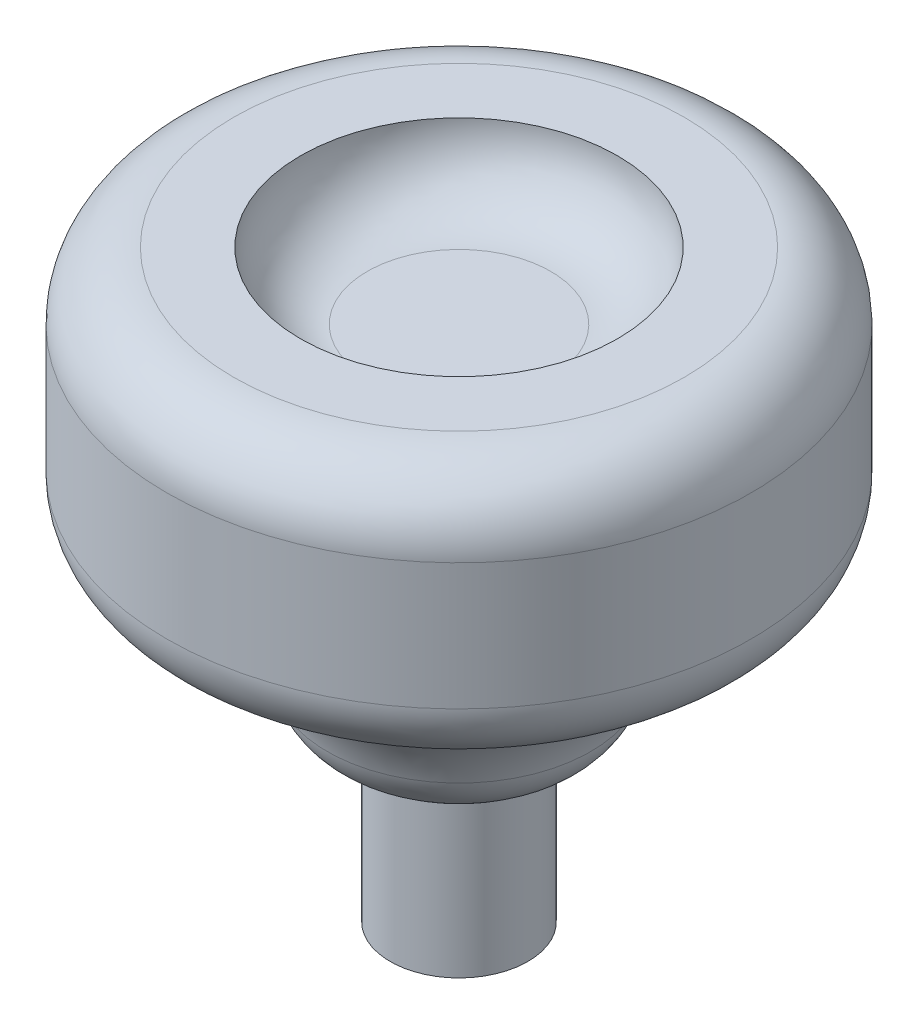
ISO-10303-21;
HEADER;
FILE_DESCRIPTION(('STEP AP214'),'2;1');
FILE_NAME('part.step','',(''),(''),'','','');
FILE_SCHEMA(('AUTOMOTIVE_DESIGN { 1 0 10303 214 1 1 1 1 }'));
ENDSEC;
DATA;
#1=APPLICATION_CONTEXT('core data for automotive mechanical design processes');
#2=APPLICATION_PROTOCOL_DEFINITION('international standard','automotive_design',2000,#1);
#3=PRODUCT_CONTEXT('',#1,'mechanical');
#4=PRODUCT('Part','Part','',(#3));
#5=PRODUCT_RELATED_PRODUCT_CATEGORY('part','',(#4));
#6=PRODUCT_DEFINITION_FORMATION('','',#4);
#7=PRODUCT_DEFINITION_CONTEXT('part definition',#1,'design');
#8=PRODUCT_DEFINITION('design','',#6,#7);
#9=PRODUCT_DEFINITION_SHAPE('','',#8);
#10=(LENGTH_UNIT() NAMED_UNIT(*) SI_UNIT(.MILLI.,.METRE.));
#11=(NAMED_UNIT(*) PLANE_ANGLE_UNIT() SI_UNIT($,.RADIAN.));
#12=(NAMED_UNIT(*) SI_UNIT($,.STERADIAN.) SOLID_ANGLE_UNIT());
#13=UNCERTAINTY_MEASURE_WITH_UNIT(LENGTH_MEASURE(1.E-05),#10,'distance_accuracy_value','');
#14=(GEOMETRIC_REPRESENTATION_CONTEXT(3) GLOBAL_UNCERTAINTY_ASSIGNED_CONTEXT((#13)) GLOBAL_UNIT_ASSIGNED_CONTEXT((#10,
#11,#12)) REPRESENTATION_CONTEXT('',''));
#15=CARTESIAN_POINT('',(0.,0.,0.));
#16=DIRECTION('',(0.,0.,1.));
#17=DIRECTION('',(1.,0.,0.));
#18=AXIS2_PLACEMENT_3D('',#15,#16,#17);
#19=CARTESIAN_POINT('',(0.,6.35,0.));
#20=DIRECTION('',(0.,-1.,0.));
#21=DIRECTION('',(0.,0.,-1.));
#22=AXIS2_PLACEMENT_3D('',#19,#20,#21);
#23=TOROIDAL_SURFACE('',#22,11.1125,6.35);
#24=CARTESIAN_POINT('',(0.,12.4352992816244,0.));
#25=DIRECTION('',(0.,-1.,0.));
#26=DIRECTION('',(0.,0.,-1.));
#27=AXIS2_PLACEMENT_3D('',#24,#25,#26);
#28=CIRCLE('',#27,9.29821428571429);
#29=CARTESIAN_POINT('',(0.,12.4352992816244,-9.29821428571429));
#30=VERTEX_POINT('',#29);
#31=EDGE_CURVE('E70',#30,#30,#28,.T.);
#32=ORIENTED_EDGE('',*,*,#31,.T.);
#33=EDGE_LOOP('',(#32));
#34=FACE_BOUND('',#33,.T.);
#35=CARTESIAN_POINT('',(0.,8.11237453417952,0.));
#36=DIRECTION('',(0.,-1.,0.));
#37=DIRECTION('',(0.,0.,-1.));
#38=AXIS2_PLACEMENT_3D('',#35,#36,#37);
#39=CIRCLE('',#38,5.01196428571429);
#40=CARTESIAN_POINT('',(0.,8.11237453417952,-5.01196428571429));
#41=VERTEX_POINT('',#40);
#42=EDGE_CURVE('E74',#41,#41,#39,.F.);
#43=ORIENTED_EDGE('',*,*,#42,.T.);
#44=EDGE_LOOP('',(#43));
#45=FACE_BOUND('',#44,.T.);
#46=ADVANCED_FACE('F46',(#34,#45),#23,.F.);
#47=CARTESIAN_POINT('',(0.,0.,0.));
#48=DIRECTION('',(0.,-1.,0.));
#49=DIRECTION('',(0.,0.,-1.));
#50=AXIS2_PLACEMENT_3D('',#47,#48,#49);
#51=CYLINDRICAL_SURFACE('',#50,11.1125);
#52=CARTESIAN_POINT('',(0.,14.8694189942742,0.));
#53=DIRECTION('',(0.,1.,0.));
#54=DIRECTION('',(0.,0.,1.));
#55=AXIS2_PLACEMENT_3D('',#52,#53,#54);
#56=CIRCLE('',#55,11.1125);
#57=CARTESIAN_POINT('',(0.,14.8694189942742,11.1125));
#58=VERTEX_POINT('',#57);
#59=EDGE_CURVE('E59',#58,#58,#56,.T.);
#60=ORIENTED_EDGE('',*,*,#59,.T.);
#61=EDGE_LOOP('',(#60));
#62=FACE_BOUND('',#61,.T.);
#63=CARTESIAN_POINT('',(0.,19.685,0.));
#64=DIRECTION('',(0.,-1.,0.));
#65=DIRECTION('',(0.,0.,-1.));
#66=AXIS2_PLACEMENT_3D('',#63,#64,#65);
#67=CIRCLE('',#66,11.1125);
#68=CARTESIAN_POINT('',(0.,19.685,-11.1125));
#69=VERTEX_POINT('',#68);
#70=EDGE_CURVE('E64',#69,#69,#67,.T.);
#71=ORIENTED_EDGE('',*,*,#70,.T.);
#72=EDGE_LOOP('',(#71));
#73=FACE_BOUND('',#72,.T.);
#74=ADVANCED_FACE('F114',(#62,#73),#51,.T.);
#75=CARTESIAN_POINT('',(0.,22.225,0.));
#76=DIRECTION('',(0.,-1.,0.));
#77=DIRECTION('',(0.,0.,-1.));
#78=AXIS2_PLACEMENT_3D('',#75,#76,#77);
#79=PLANE('',#78);
#80=CARTESIAN_POINT('',(0.,22.225,0.));
#81=DIRECTION('',(0.,1.,0.));
#82=DIRECTION('',(0.,0.,1.));
#83=AXIS2_PLACEMENT_3D('',#80,#81,#82);
#84=CIRCLE('',#83,6.03249999999998);
#85=CARTESIAN_POINT('',(0.,22.225,6.03249999999998));
#86=VERTEX_POINT('',#85);
#87=EDGE_CURVE('E78',#86,#86,#84,.T.);
#88=ORIENTED_EDGE('',*,*,#87,.F.);
#89=EDGE_LOOP('',(#88));
#90=FACE_BOUND('',#89,.T.);
#91=CARTESIAN_POINT('',(0.,22.225,0.));
#92=DIRECTION('',(0.,-1.,0.));
#93=DIRECTION('',(0.,0.,-1.));
#94=AXIS2_PLACEMENT_3D('',#91,#92,#93);
#95=CIRCLE('',#94,8.5725);
#96=CARTESIAN_POINT('',(0.,22.225,-8.5725));
#97=VERTEX_POINT('',#96);
#98=EDGE_CURVE('E54',#97,#97,#95,.F.);
#99=ORIENTED_EDGE('',*,*,#98,.T.);
#100=EDGE_LOOP('',(#99));
#101=FACE_BOUND('',#100,.T.);
#102=ADVANCED_FACE('F120',(#90,#101),#79,.F.);
#103=CARTESIAN_POINT('',(0.,14.8694189942742,0.));
#104=DIRECTION('',(0.,1.,0.));
#105=DIRECTION('',(0.,0.,1.));
#106=AXIS2_PLACEMENT_3D('',#103,#104,#105);
#107=TOROIDAL_SURFACE('',#106,8.5725,2.54);
#108=ORIENTED_EDGE('',*,*,#59,.F.);
#109=EDGE_LOOP('',(#108));
#110=FACE_BOUND('',#109,.T.);
#111=ORIENTED_EDGE('',*,*,#31,.F.);
#112=EDGE_LOOP('',(#111));
#113=FACE_BOUND('',#112,.T.);
#114=ADVANCED_FACE('F126',(#110,#113),#107,.T.);
#115=CARTESIAN_POINT('',(0.,8.81732434785133,0.));
#116=DIRECTION('',(0.,-1.,0.));
#117=DIRECTION('',(0.,0.,-1.));
#118=AXIS2_PLACEMENT_3D('',#115,#116,#117);
#119=TOROIDAL_SURFACE('',#118,2.57175,2.54);
#120=ORIENTED_EDGE('',*,*,#42,.F.);
#121=EDGE_LOOP('',(#120));
#122=FACE_BOUND('',#121,.T.);
#123=CARTESIAN_POINT('',(0.,6.35,0.));
#124=DIRECTION('',(0.,-1.,0.));
#125=DIRECTION('',(0.,0.,-1.));
#126=AXIS2_PLACEMENT_3D('',#123,#124,#125);
#127=CIRCLE('',#126,3.175);
#128=CARTESIAN_POINT('',(0.,6.35,-3.175));
#129=VERTEX_POINT('',#128);
#130=EDGE_CURVE('E82',#129,#129,#127,.F.);
#131=ORIENTED_EDGE('',*,*,#130,.T.);
#132=EDGE_LOOP('',(#131));
#133=FACE_BOUND('',#132,.T.);
#134=ADVANCED_FACE('F129',(#122,#133),#119,.T.);
#135=CARTESIAN_POINT('',(0.,19.685,0.));
#136=DIRECTION('',(0.,-1.,0.));
#137=DIRECTION('',(0.,0.,-1.));
#138=AXIS2_PLACEMENT_3D('',#135,#136,#137);
#139=TOROIDAL_SURFACE('',#138,8.5725,2.54);
#140=ORIENTED_EDGE('',*,*,#98,.F.);
#141=EDGE_LOOP('',(#140));
#142=FACE_BOUND('',#141,.T.);
#143=ORIENTED_EDGE('',*,*,#70,.F.);
#144=EDGE_LOOP('',(#143));
#145=FACE_BOUND('',#144,.T.);
#146=ADVANCED_FACE('F132',(#142,#145),#139,.T.);
#147=CARTESIAN_POINT('',(0.,19.685,0.));
#148=DIRECTION('',(0.,1.,0.));
#149=DIRECTION('',(0.,0.,1.));
#150=AXIS2_PLACEMENT_3D('',#147,#148,#149);
#151=PLANE('',#150);
#152=CARTESIAN_POINT('',(0.,19.685,0.));
#153=DIRECTION('',(0.,1.,0.));
#154=DIRECTION('',(0.,0.,1.));
#155=AXIS2_PLACEMENT_3D('',#152,#153,#154);
#156=CIRCLE('',#155,3.49249999999998);
#157=CARTESIAN_POINT('',(0.,19.685,3.49249999999998));
#158=VERTEX_POINT('',#157);
#159=EDGE_CURVE('E11',#158,#158,#156,.T.);
#160=ORIENTED_EDGE('',*,*,#159,.T.);
#161=EDGE_LOOP('',(#160));
#162=FACE_BOUND('',#161,.T.);
#163=ADVANCED_FACE('F109',(#162),#151,.T.);
#164=CARTESIAN_POINT('',(0.,22.225,0.));
#165=DIRECTION('',(0.,1.,0.));
#166=DIRECTION('',(0.,0.,1.));
#167=AXIS2_PLACEMENT_3D('',#164,#165,#166);
#168=TOROIDAL_SURFACE('',#167,3.49249999999998,2.54);
#169=ORIENTED_EDGE('',*,*,#87,.T.);
#170=EDGE_LOOP('',(#169));
#171=FACE_BOUND('',#170,.T.);
#172=ORIENTED_EDGE('',*,*,#159,.F.);
#173=EDGE_LOOP('',(#172));
#174=FACE_BOUND('',#173,.T.);
#175=ADVANCED_FACE('F48',(#171,#174),#168,.F.);
#176=CARTESIAN_POINT('',(0.,6.35,0.));
#177=DIRECTION('',(0.,-1.,0.));
#178=DIRECTION('',(0.,0.,-1.));
#179=AXIS2_PLACEMENT_3D('',#176,#177,#178);
#180=PLANE('',#179);
#181=ORIENTED_EDGE('',*,*,#130,.F.);
#182=EDGE_LOOP('',(#181));
#183=FACE_BOUND('',#182,.T.);
#184=CARTESIAN_POINT('',(0.,6.35,0.));
#185=DIRECTION('',(0.,-1.,0.));
#186=DIRECTION('',(0.,0.,-1.));
#187=AXIS2_PLACEMENT_3D('',#184,#185,#186);
#188=CIRCLE('',#187,2.62);
#189=CARTESIAN_POINT('',(0.,6.35,-2.62));
#190=VERTEX_POINT('',#189);
#191=EDGE_CURVE('E86',#190,#190,#188,.T.);
#192=ORIENTED_EDGE('',*,*,#191,.F.);
#193=EDGE_LOOP('',(#192));
#194=FACE_BOUND('',#193,.T.);
#195=ADVANCED_FACE('F98',(#183,#194),#180,.T.);
#196=CARTESIAN_POINT('',(0.,6.35,0.));
#197=DIRECTION('',(0.,-1.,0.));
#198=DIRECTION('',(0.,0.,-1.));
#199=AXIS2_PLACEMENT_3D('',#196,#197,#198);
#200=CYLINDRICAL_SURFACE('',#199,2.62);
#201=ORIENTED_EDGE('',*,*,#191,.T.);
#202=EDGE_LOOP('',(#201));
#203=FACE_BOUND('',#202,.T.);
#204=CARTESIAN_POINT('',(0.,0.,0.));
#205=DIRECTION('',(0.,-1.,0.));
#206=DIRECTION('',(0.,0.,-1.));
#207=AXIS2_PLACEMENT_3D('',#204,#205,#206);
#208=CIRCLE('',#207,2.62);
#209=CARTESIAN_POINT('',(0.,0.,-2.62));
#210=VERTEX_POINT('',#209);
#211=EDGE_CURVE('E87',#210,#210,#208,.T.);
#212=ORIENTED_EDGE('',*,*,#211,.F.);
#213=EDGE_LOOP('',(#212));
#214=FACE_BOUND('',#213,.T.);
#215=ADVANCED_FACE('F95',(#203,#214),#200,.T.);
#216=CARTESIAN_POINT('',(0.,0.,0.));
#217=DIRECTION('',(0.,1.,0.));
#218=DIRECTION('',(0.,0.,1.));
#219=AXIS2_PLACEMENT_3D('',#216,#217,#218);
#220=PLANE('',#219);
#221=ORIENTED_EDGE('',*,*,#211,.T.);
#222=EDGE_LOOP('',(#221));
#223=FACE_BOUND('',#222,.T.);
#224=ADVANCED_FACE('F106',(#223),#220,.F.);
#225=CLOSED_SHELL('',(#46,#74,#102,#114,#134,#146,#163,#175,#195,#215,#224));
#226=MANIFOLD_SOLID_BREP('B2',#225);
#227=ADVANCED_BREP_SHAPE_REPRESENTATION('',(#18,#226),#14);
#228=SHAPE_DEFINITION_REPRESENTATION(#9,#227);
ENDSEC;
END-ISO-10303-21;
